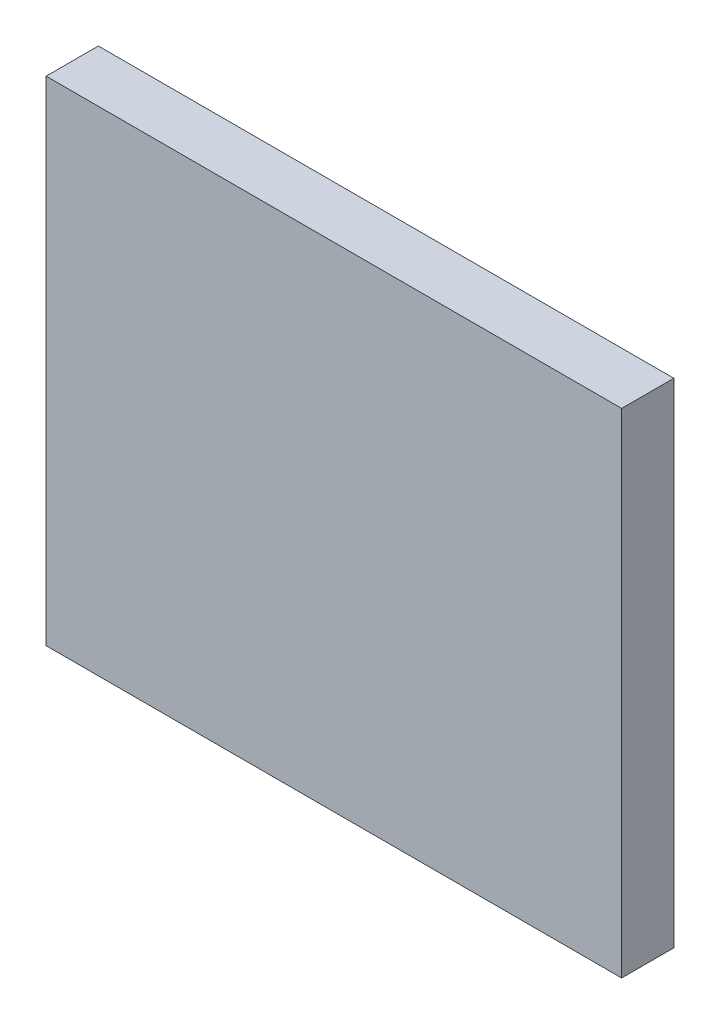
ISO-10303-21;
HEADER;
FILE_DESCRIPTION(('STEP AP214'),'2;1');
FILE_NAME('part.step','',(''),(''),'','','');
FILE_SCHEMA(('AUTOMOTIVE_DESIGN { 1 0 10303 214 1 1 1 1 }'));
ENDSEC;
DATA;
#1=APPLICATION_CONTEXT('core data for automotive mechanical design processes');
#2=APPLICATION_PROTOCOL_DEFINITION('international standard','automotive_design',2000,#1);
#3=PRODUCT_CONTEXT('',#1,'mechanical');
#4=PRODUCT('Part','Part','',(#3));
#5=PRODUCT_RELATED_PRODUCT_CATEGORY('part','',(#4));
#6=PRODUCT_DEFINITION_FORMATION('','',#4);
#7=PRODUCT_DEFINITION_CONTEXT('part definition',#1,'design');
#8=PRODUCT_DEFINITION('design','',#6,#7);
#9=PRODUCT_DEFINITION_SHAPE('','',#8);
#10=(LENGTH_UNIT() NAMED_UNIT(*) SI_UNIT(.MILLI.,.METRE.));
#11=(NAMED_UNIT(*) PLANE_ANGLE_UNIT() SI_UNIT($,.RADIAN.));
#12=(NAMED_UNIT(*) SI_UNIT($,.STERADIAN.) SOLID_ANGLE_UNIT());
#13=UNCERTAINTY_MEASURE_WITH_UNIT(LENGTH_MEASURE(1.E-05),#10,'distance_accuracy_value','');
#14=(GEOMETRIC_REPRESENTATION_CONTEXT(3) GLOBAL_UNCERTAINTY_ASSIGNED_CONTEXT((#13)) GLOBAL_UNIT_ASSIGNED_CONTEXT((#10,
#11,#12)) REPRESENTATION_CONTEXT('',''));
#15=CARTESIAN_POINT('',(0.,0.,0.));
#16=DIRECTION('',(0.,0.,1.));
#17=DIRECTION('',(1.,0.,0.));
#18=AXIS2_PLACEMENT_3D('',#15,#16,#17);
#19=CARTESIAN_POINT('',(-140.,-120.,25.4));
#20=DIRECTION('',(1.,0.,0.));
#21=DIRECTION('',(0.,0.,-1.));
#22=AXIS2_PLACEMENT_3D('',#19,#20,#21);
#23=PLANE('',#22);
#24=DIRECTION('',(0.,-1.,0.));
#25=VECTOR('',#24,1.);
#26=CARTESIAN_POINT('',(-140.,-120.,0.));
#27=LINE('',#26,#25);
#28=CARTESIAN_POINT('',(-140.,120.,0.));
#29=VERTEX_POINT('',#28);
#30=CARTESIAN_POINT('',(-140.,-120.,0.));
#31=VERTEX_POINT('',#30);
#32=EDGE_CURVE('E96',#29,#31,#27,.T.);
#33=ORIENTED_EDGE('',*,*,#32,.T.);
#34=DIRECTION('',(0.,0.,-1.));
#35=VECTOR('',#34,1.);
#36=CARTESIAN_POINT('',(-140.,-120.,25.4));
#37=LINE('',#36,#35);
#38=CARTESIAN_POINT('',(-140.,-120.,25.4));
#39=VERTEX_POINT('',#38);
#40=EDGE_CURVE('E11',#39,#31,#37,.T.);
#41=ORIENTED_EDGE('',*,*,#40,.F.);
#42=DIRECTION('',(0.,-1.,0.));
#43=VECTOR('',#42,1.);
#44=CARTESIAN_POINT('',(-140.,-120.,25.4));
#45=LINE('',#44,#43);
#46=CARTESIAN_POINT('',(-140.,120.,25.4));
#47=VERTEX_POINT('',#46);
#48=EDGE_CURVE('E84',#47,#39,#45,.T.);
#49=ORIENTED_EDGE('',*,*,#48,.F.);
#50=DIRECTION('',(0.,0.,-1.));
#51=VECTOR('',#50,1.);
#52=CARTESIAN_POINT('',(-140.,120.,25.4));
#53=LINE('',#52,#51);
#54=EDGE_CURVE('E92',#47,#29,#53,.T.);
#55=ORIENTED_EDGE('',*,*,#54,.T.);
#56=EDGE_LOOP('',(#33,#41,#49,#55));
#57=FACE_BOUND('',#56,.T.);
#58=ADVANCED_FACE('F33',(#57),#23,.F.);
#59=CARTESIAN_POINT('',(140.,-120.,25.4));
#60=DIRECTION('',(0.,1.,0.));
#61=DIRECTION('',(-1.,0.,0.));
#62=AXIS2_PLACEMENT_3D('',#59,#60,#61);
#63=PLANE('',#62);
#64=DIRECTION('',(1.,0.,0.));
#65=VECTOR('',#64,1.);
#66=CARTESIAN_POINT('',(140.,-120.,0.));
#67=LINE('',#66,#65);
#68=CARTESIAN_POINT('',(140.,-120.,0.));
#69=VERTEX_POINT('',#68);
#70=EDGE_CURVE('E88',#31,#69,#67,.T.);
#71=ORIENTED_EDGE('',*,*,#70,.T.);
#72=DIRECTION('',(0.,0.,-1.));
#73=VECTOR('',#72,1.);
#74=CARTESIAN_POINT('',(140.,-120.,25.4));
#75=LINE('',#74,#73);
#76=CARTESIAN_POINT('',(140.,-120.,25.4));
#77=VERTEX_POINT('',#76);
#78=EDGE_CURVE('E41',#77,#69,#75,.T.);
#79=ORIENTED_EDGE('',*,*,#78,.F.);
#80=DIRECTION('',(1.,0.,0.));
#81=VECTOR('',#80,1.);
#82=CARTESIAN_POINT('',(140.,-120.,25.4));
#83=LINE('',#82,#81);
#84=EDGE_CURVE('E79',#39,#77,#83,.T.);
#85=ORIENTED_EDGE('',*,*,#84,.F.);
#86=ORIENTED_EDGE('',*,*,#40,.T.);
#87=EDGE_LOOP('',(#71,#79,#85,#86));
#88=FACE_BOUND('',#87,.T.);
#89=ADVANCED_FACE('F87',(#88),#63,.F.);
#90=CARTESIAN_POINT('',(140.,-120.,25.4));
#91=DIRECTION('',(-1.,0.,0.));
#92=DIRECTION('',(0.,0.,1.));
#93=AXIS2_PLACEMENT_3D('',#90,#91,#92);
#94=PLANE('',#93);
#95=DIRECTION('',(0.,1.,0.));
#96=VECTOR('',#95,1.);
#97=CARTESIAN_POINT('',(140.,-120.,0.));
#98=LINE('',#97,#96);
#99=CARTESIAN_POINT('',(140.,120.,0.));
#100=VERTEX_POINT('',#99);
#101=EDGE_CURVE('E66',#69,#100,#98,.T.);
#102=ORIENTED_EDGE('',*,*,#101,.T.);
#103=DIRECTION('',(0.,0.,-1.));
#104=VECTOR('',#103,1.);
#105=CARTESIAN_POINT('',(140.,120.,25.4));
#106=LINE('',#105,#104);
#107=CARTESIAN_POINT('',(140.,120.,25.4));
#108=VERTEX_POINT('',#107);
#109=EDGE_CURVE('E89',#108,#100,#106,.T.);
#110=ORIENTED_EDGE('',*,*,#109,.F.);
#111=DIRECTION('',(0.,1.,0.));
#112=VECTOR('',#111,1.);
#113=CARTESIAN_POINT('',(140.,-120.,25.4));
#114=LINE('',#113,#112);
#115=EDGE_CURVE('E82',#77,#108,#114,.T.);
#116=ORIENTED_EDGE('',*,*,#115,.F.);
#117=ORIENTED_EDGE('',*,*,#78,.T.);
#118=EDGE_LOOP('',(#102,#110,#116,#117));
#119=FACE_BOUND('',#118,.T.);
#120=ADVANCED_FACE('F90',(#119),#94,.F.);
#121=CARTESIAN_POINT('',(140.,120.,25.4));
#122=DIRECTION('',(0.,-1.,0.));
#123=DIRECTION('',(1.,0.,0.));
#124=AXIS2_PLACEMENT_3D('',#121,#122,#123);
#125=PLANE('',#124);
#126=DIRECTION('',(-1.,0.,0.));
#127=VECTOR('',#126,1.);
#128=CARTESIAN_POINT('',(140.,120.,0.));
#129=LINE('',#128,#127);
#130=EDGE_CURVE('E72',#100,#29,#129,.T.);
#131=ORIENTED_EDGE('',*,*,#130,.T.);
#132=ORIENTED_EDGE('',*,*,#54,.F.);
#133=DIRECTION('',(-1.,0.,0.));
#134=VECTOR('',#133,1.);
#135=CARTESIAN_POINT('',(140.,120.,25.4));
#136=LINE('',#135,#134);
#137=EDGE_CURVE('E49',#108,#47,#136,.T.);
#138=ORIENTED_EDGE('',*,*,#137,.F.);
#139=ORIENTED_EDGE('',*,*,#109,.T.);
#140=EDGE_LOOP('',(#131,#132,#138,#139));
#141=FACE_BOUND('',#140,.T.);
#142=ADVANCED_FACE('F103',(#141),#125,.F.);
#143=CARTESIAN_POINT('',(0.,0.,25.4));
#144=DIRECTION('',(0.,0.,1.));
#145=DIRECTION('',(1.,0.,0.));
#146=AXIS2_PLACEMENT_3D('',#143,#144,#145);
#147=PLANE('',#146);
#148=ORIENTED_EDGE('',*,*,#48,.T.);
#149=ORIENTED_EDGE('',*,*,#84,.T.);
#150=ORIENTED_EDGE('',*,*,#115,.T.);
#151=ORIENTED_EDGE('',*,*,#137,.T.);
#152=EDGE_LOOP('',(#148,#149,#150,#151));
#153=FACE_BOUND('',#152,.T.);
#154=ADVANCED_FACE('F80',(#153),#147,.T.);
#155=CARTESIAN_POINT('',(0.,0.,0.));
#156=DIRECTION('',(0.,0.,1.));
#157=DIRECTION('',(1.,0.,0.));
#158=AXIS2_PLACEMENT_3D('',#155,#156,#157);
#159=PLANE('',#158);
#160=ORIENTED_EDGE('',*,*,#32,.F.);
#161=ORIENTED_EDGE('',*,*,#130,.F.);
#162=ORIENTED_EDGE('',*,*,#101,.F.);
#163=ORIENTED_EDGE('',*,*,#70,.F.);
#164=EDGE_LOOP('',(#160,#161,#162,#163));
#165=FACE_BOUND('',#164,.T.);
#166=ADVANCED_FACE('F106',(#165),#159,.F.);
#167=CLOSED_SHELL('',(#58,#89,#120,#142,#154,#166));
#168=MANIFOLD_SOLID_BREP('B2',#167);
#169=ADVANCED_BREP_SHAPE_REPRESENTATION('',(#18,#168),#14);
#170=SHAPE_DEFINITION_REPRESENTATION(#9,#169);
ENDSEC;
END-ISO-10303-21;
